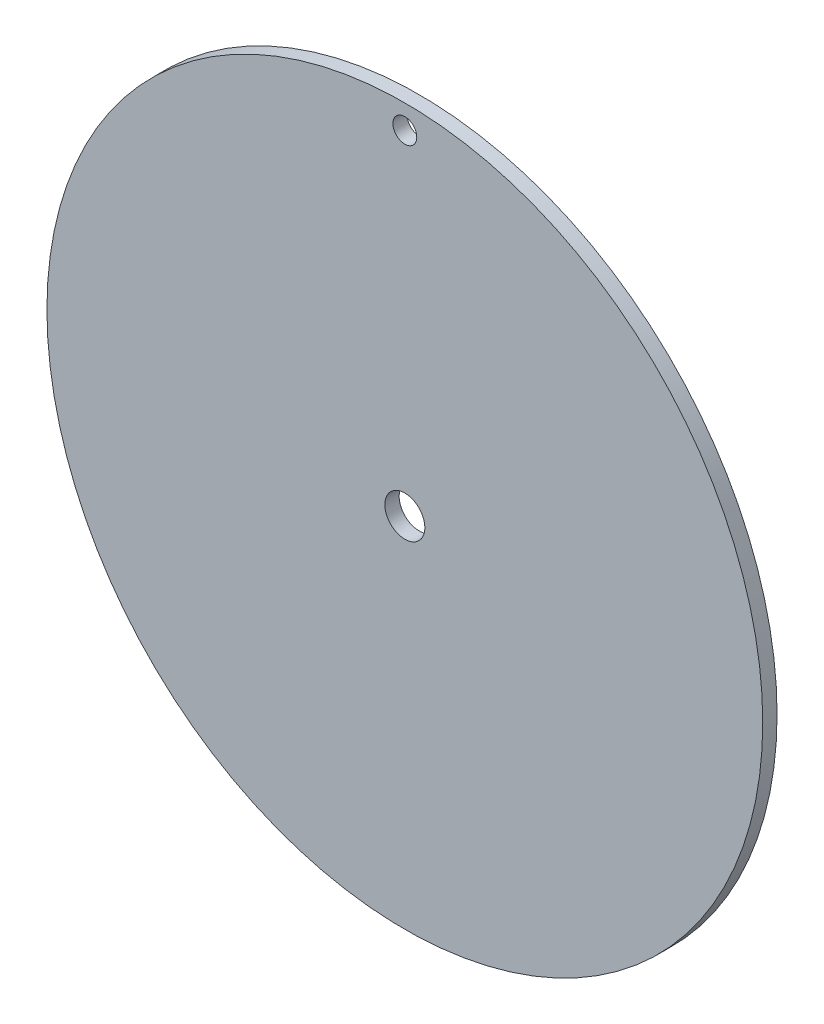
ISO-10303-21;
HEADER;
FILE_DESCRIPTION(('STEP AP214'),'2;1');
FILE_NAME('part.step','',(''),(''),'','','');
FILE_SCHEMA(('AUTOMOTIVE_DESIGN { 1 0 10303 214 1 1 1 1 }'));
ENDSEC;
DATA;
#1=APPLICATION_CONTEXT('core data for automotive mechanical design processes');
#2=APPLICATION_PROTOCOL_DEFINITION('international standard','automotive_design',2000,#1);
#3=PRODUCT_CONTEXT('',#1,'mechanical');
#4=PRODUCT('Part','Part','',(#3));
#5=PRODUCT_RELATED_PRODUCT_CATEGORY('part','',(#4));
#6=PRODUCT_DEFINITION_FORMATION('','',#4);
#7=PRODUCT_DEFINITION_CONTEXT('part definition',#1,'design');
#8=PRODUCT_DEFINITION('design','',#6,#7);
#9=PRODUCT_DEFINITION_SHAPE('','',#8);
#10=(LENGTH_UNIT() NAMED_UNIT(*) SI_UNIT(.MILLI.,.METRE.));
#11=(NAMED_UNIT(*) PLANE_ANGLE_UNIT() SI_UNIT($,.RADIAN.));
#12=(NAMED_UNIT(*) SI_UNIT($,.STERADIAN.) SOLID_ANGLE_UNIT());
#13=UNCERTAINTY_MEASURE_WITH_UNIT(LENGTH_MEASURE(1.E-05),#10,'distance_accuracy_value','');
#14=(GEOMETRIC_REPRESENTATION_CONTEXT(3) GLOBAL_UNCERTAINTY_ASSIGNED_CONTEXT((#13)) GLOBAL_UNIT_ASSIGNED_CONTEXT((#10,
#11,#12)) REPRESENTATION_CONTEXT('',''));
#15=CARTESIAN_POINT('',(0.,0.,0.));
#16=DIRECTION('',(0.,0.,1.));
#17=DIRECTION('',(1.,0.,0.));
#18=AXIS2_PLACEMENT_3D('',#15,#16,#17);
#19=CARTESIAN_POINT('',(0.,0.,3.));
#20=DIRECTION('',(0.,0.,1.));
#21=DIRECTION('',(1.,0.,0.));
#22=AXIS2_PLACEMENT_3D('',#19,#20,#21);
#23=PLANE('',#22);
#24=CARTESIAN_POINT('',(0.,0.,3.));
#25=DIRECTION('',(0.,0.,1.));
#26=DIRECTION('',(1.,0.,0.));
#27=AXIS2_PLACEMENT_3D('',#24,#25,#26);
#28=CIRCLE('',#27,4.19);
#29=CARTESIAN_POINT('',(4.19,0.,3.));
#30=VERTEX_POINT('',#29);
#31=EDGE_CURVE('E52',#30,#30,#28,.T.);
#32=ORIENTED_EDGE('',*,*,#31,.F.);
#33=EDGE_LOOP('',(#32));
#34=FACE_BOUND('',#33,.T.);
#35=CARTESIAN_POINT('',(0.,0.,3.));
#36=DIRECTION('',(0.,0.,1.));
#37=DIRECTION('',(1.,0.,0.));
#38=AXIS2_PLACEMENT_3D('',#35,#36,#37);
#39=CIRCLE('',#38,75.);
#40=CARTESIAN_POINT('',(75.,0.,3.));
#41=VERTEX_POINT('',#40);
#42=EDGE_CURVE('E10',#41,#41,#39,.T.);
#43=ORIENTED_EDGE('',*,*,#42,.T.);
#44=EDGE_LOOP('',(#43));
#45=FACE_BOUND('',#44,.T.);
#46=CARTESIAN_POINT('',(0.,70.,3.));
#47=DIRECTION('',(0.,0.,1.));
#48=DIRECTION('',(1.,0.,0.));
#49=AXIS2_PLACEMENT_3D('',#46,#47,#48);
#50=CIRCLE('',#49,2.5);
#51=CARTESIAN_POINT('',(2.5,70.,3.));
#52=VERTEX_POINT('',#51);
#53=EDGE_CURVE('E44',#52,#52,#50,.T.);
#54=ORIENTED_EDGE('',*,*,#53,.F.);
#55=EDGE_LOOP('',(#54));
#56=FACE_BOUND('',#55,.T.);
#57=ADVANCED_FACE('F33',(#34,#45,#56),#23,.T.);
#58=CARTESIAN_POINT('',(0.,0.,0.));
#59=DIRECTION('',(0.,0.,1.));
#60=DIRECTION('',(1.,0.,0.));
#61=AXIS2_PLACEMENT_3D('',#58,#59,#60);
#62=PLANE('',#61);
#63=CARTESIAN_POINT('',(0.,0.,0.));
#64=DIRECTION('',(0.,0.,1.));
#65=DIRECTION('',(1.,0.,0.));
#66=AXIS2_PLACEMENT_3D('',#63,#64,#65);
#67=CIRCLE('',#66,4.19);
#68=CARTESIAN_POINT('',(4.19,0.,0.));
#69=VERTEX_POINT('',#68);
#70=EDGE_CURVE('E49',#69,#69,#67,.T.);
#71=ORIENTED_EDGE('',*,*,#70,.T.);
#72=EDGE_LOOP('',(#71));
#73=FACE_BOUND('',#72,.T.);
#74=CARTESIAN_POINT('',(0.,0.,0.));
#75=DIRECTION('',(0.,0.,1.));
#76=DIRECTION('',(1.,0.,0.));
#77=AXIS2_PLACEMENT_3D('',#74,#75,#76);
#78=CIRCLE('',#77,75.);
#79=CARTESIAN_POINT('',(75.,0.,0.));
#80=VERTEX_POINT('',#79);
#81=EDGE_CURVE('E37',#80,#80,#78,.T.);
#82=ORIENTED_EDGE('',*,*,#81,.F.);
#83=EDGE_LOOP('',(#82));
#84=FACE_BOUND('',#83,.T.);
#85=CARTESIAN_POINT('',(0.,70.,0.));
#86=DIRECTION('',(0.,0.,1.));
#87=DIRECTION('',(1.,0.,0.));
#88=AXIS2_PLACEMENT_3D('',#85,#86,#87);
#89=CIRCLE('',#88,2.5);
#90=CARTESIAN_POINT('',(2.5,70.,0.));
#91=VERTEX_POINT('',#90);
#92=EDGE_CURVE('E46',#91,#91,#89,.T.);
#93=ORIENTED_EDGE('',*,*,#92,.T.);
#94=EDGE_LOOP('',(#93));
#95=FACE_BOUND('',#94,.T.);
#96=ADVANCED_FACE('F58',(#73,#84,#95),#62,.F.);
#97=CARTESIAN_POINT('',(0.,0.,3.));
#98=DIRECTION('',(0.,0.,-1.));
#99=DIRECTION('',(-1.,0.,0.));
#100=AXIS2_PLACEMENT_3D('',#97,#98,#99);
#101=CYLINDRICAL_SURFACE('',#100,75.);
#102=ORIENTED_EDGE('',*,*,#42,.F.);
#103=EDGE_LOOP('',(#102));
#104=FACE_BOUND('',#103,.T.);
#105=ORIENTED_EDGE('',*,*,#81,.T.);
#106=EDGE_LOOP('',(#105));
#107=FACE_BOUND('',#106,.T.);
#108=ADVANCED_FACE('F35',(#104,#107),#101,.T.);
#109=CARTESIAN_POINT('',(0.,70.,3.));
#110=DIRECTION('',(0.,0.,-1.));
#111=DIRECTION('',(-1.,0.,0.));
#112=AXIS2_PLACEMENT_3D('',#109,#110,#111);
#113=CYLINDRICAL_SURFACE('',#112,2.5);
#114=ORIENTED_EDGE('',*,*,#53,.T.);
#115=EDGE_LOOP('',(#114));
#116=FACE_BOUND('',#115,.T.);
#117=ORIENTED_EDGE('',*,*,#92,.F.);
#118=EDGE_LOOP('',(#117));
#119=FACE_BOUND('',#118,.T.);
#120=ADVANCED_FACE('F64',(#116,#119),#113,.F.);
#121=CARTESIAN_POINT('',(0.,0.,0.));
#122=DIRECTION('',(0.,0.,1.));
#123=DIRECTION('',(1.,0.,0.));
#124=AXIS2_PLACEMENT_3D('',#121,#122,#123);
#125=CYLINDRICAL_SURFACE('',#124,4.19);
#126=ORIENTED_EDGE('',*,*,#70,.F.);
#127=EDGE_LOOP('',(#126));
#128=FACE_BOUND('',#127,.T.);
#129=ORIENTED_EDGE('',*,*,#31,.T.);
#130=EDGE_LOOP('',(#129));
#131=FACE_BOUND('',#130,.T.);
#132=ADVANCED_FACE('F61',(#128,#131),#125,.F.);
#133=CLOSED_SHELL('',(#57,#96,#108,#120,#132));
#134=MANIFOLD_SOLID_BREP('B2',#133);
#135=ADVANCED_BREP_SHAPE_REPRESENTATION('',(#18,#134),#14);
#136=SHAPE_DEFINITION_REPRESENTATION(#9,#135);
ENDSEC;
END-ISO-10303-21;
